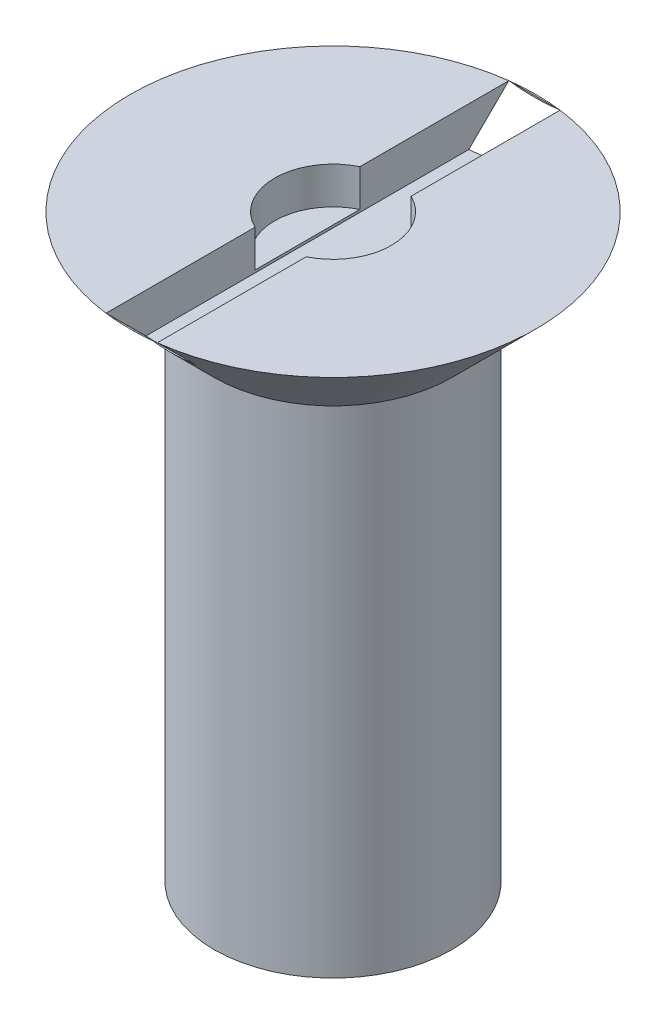
ISO-10303-21;
HEADER;
FILE_DESCRIPTION(('STEP AP214'),'2;1');
FILE_NAME('part.step','',(''),(''),'','','');
FILE_SCHEMA(('AUTOMOTIVE_DESIGN { 1 0 10303 214 1 1 1 1 }'));
ENDSEC;
DATA;
#1=APPLICATION_CONTEXT('core data for automotive mechanical design processes');
#2=APPLICATION_PROTOCOL_DEFINITION('international standard','automotive_design',2000,#1);
#3=PRODUCT_CONTEXT('',#1,'mechanical');
#4=PRODUCT('Part','Part','',(#3));
#5=PRODUCT_RELATED_PRODUCT_CATEGORY('part','',(#4));
#6=PRODUCT_DEFINITION_FORMATION('','',#4);
#7=PRODUCT_DEFINITION_CONTEXT('part definition',#1,'design');
#8=PRODUCT_DEFINITION('design','',#6,#7);
#9=PRODUCT_DEFINITION_SHAPE('','',#8);
#10=(LENGTH_UNIT() NAMED_UNIT(*) SI_UNIT(.MILLI.,.METRE.));
#11=(NAMED_UNIT(*) PLANE_ANGLE_UNIT() SI_UNIT($,.RADIAN.));
#12=(NAMED_UNIT(*) SI_UNIT($,.STERADIAN.) SOLID_ANGLE_UNIT());
#13=UNCERTAINTY_MEASURE_WITH_UNIT(LENGTH_MEASURE(1.E-05),#10,'distance_accuracy_value','');
#14=(GEOMETRIC_REPRESENTATION_CONTEXT(3) GLOBAL_UNCERTAINTY_ASSIGNED_CONTEXT((#13)) GLOBAL_UNIT_ASSIGNED_CONTEXT((#10,
#11,#12)) REPRESENTATION_CONTEXT('',''));
#15=CARTESIAN_POINT('',(0.,0.,0.));
#16=DIRECTION('',(0.,0.,1.));
#17=DIRECTION('',(1.,0.,0.));
#18=AXIS2_PLACEMENT_3D('',#15,#16,#17);
#19=CARTESIAN_POINT('',(2.94385562515375,-1.86886334227875,0.));
#20=DIRECTION('',(0.,-1.,0.));
#21=DIRECTION('',(1.,0.,0.));
#22=AXIS2_PLACEMENT_3D('',#19,#20,#21);
#23=PLANE('',#22);
#24=CARTESIAN_POINT('',(0.,-1.86886334227875,0.));
#25=DIRECTION('',(0.,1.,0.));
#26=DIRECTION('',(-1.,0.,0.));
#27=AXIS2_PLACEMENT_3D('',#24,#25,#26);
#28=CIRCLE('',#27,2.94385562515375);
#29=CARTESIAN_POINT('',(-1.29163654320021,-1.86886334227875,-2.64536594482109));
#30=VERTEX_POINT('',#29);
#31=CARTESIAN_POINT('',(-1.29163654320021,-1.86886334227875,2.64536594482109));
#32=VERTEX_POINT('',#31);
#33=EDGE_CURVE('E197',#30,#32,#28,.T.);
#34=ORIENTED_EDGE('',*,*,#33,.T.);
#35=DIRECTION('',(0.,0.,-1.));
#36=VECTOR('',#35,1.);
#37=CARTESIAN_POINT('',(-1.29163654320021,-1.86886334227875,0.));
#38=LINE('',#37,#36);
#39=EDGE_CURVE('E156',#32,#30,#38,.T.);
#40=ORIENTED_EDGE('',*,*,#39,.T.);
#41=EDGE_LOOP('',(#34,#40));
#42=FACE_BOUND('',#41,.T.);
#43=ADVANCED_FACE('F49',(#42),#23,.F.);
#44=CARTESIAN_POINT('',(0.,11.6854615251355,0.));
#45=DIRECTION('',(0.,1.,0.));
#46=DIRECTION('',(-1.,0.,0.));
#47=AXIS2_PLACEMENT_3D('',#44,#45,#46);
#48=CYLINDRICAL_SURFACE('',#47,2.94385562515375);
#49=CARTESIAN_POINT('',(0.,0.,0.));
#50=DIRECTION('',(0.,1.,0.));
#51=DIRECTION('',(-1.,0.,0.));
#52=AXIS2_PLACEMENT_3D('',#49,#50,#51);
#53=CIRCLE('',#52,2.94385562515375);
#54=CARTESIAN_POINT('',(-1.29163654320021,0.,-2.64536594482109));
#55=VERTEX_POINT('',#54);
#56=CARTESIAN_POINT('',(-1.29163654320021,0.,2.64536594482109));
#57=VERTEX_POINT('',#56);
#58=EDGE_CURVE('E152',#55,#57,#53,.T.);
#59=ORIENTED_EDGE('',*,*,#58,.T.);
#60=DIRECTION('',(0.,1.,0.));
#61=VECTOR('',#60,1.);
#62=CARTESIAN_POINT('',(-1.29163654320021,11.6854615251355,2.64536594482109));
#63=LINE('',#62,#61);
#64=EDGE_CURVE('E69',#57,#32,#63,.F.);
#65=ORIENTED_EDGE('',*,*,#64,.T.);
#66=ORIENTED_EDGE('',*,*,#33,.F.);
#67=DIRECTION('',(0.,1.,0.));
#68=VECTOR('',#67,1.);
#69=CARTESIAN_POINT('',(-1.29163654320021,11.6854615251355,-2.64536594482109));
#70=LINE('',#69,#68);
#71=EDGE_CURVE('E141',#30,#55,#70,.T.);
#72=ORIENTED_EDGE('',*,*,#71,.T.);
#73=EDGE_LOOP('',(#59,#65,#66,#72));
#74=FACE_BOUND('',#73,.T.);
#75=ADVANCED_FACE('F233',(#74),#48,.F.);
#76=CARTESIAN_POINT('',(10.2426406871193,0.,0.));
#77=DIRECTION('',(0.,-1.,0.));
#78=DIRECTION('',(1.,0.,0.));
#79=AXIS2_PLACEMENT_3D('',#76,#77,#78);
#80=PLANE('',#79);
#81=ORIENTED_EDGE('',*,*,#58,.F.);
#82=DIRECTION('',(0.,0.,1.));
#83=VECTOR('',#82,1.);
#84=CARTESIAN_POINT('',(-1.29163654320021,0.,-10.1608741398415));
#85=LINE('',#84,#83);
#86=CARTESIAN_POINT('',(-1.29163654320021,0.,-10.1608741398415));
#87=VERTEX_POINT('',#86);
#88=EDGE_CURVE('E12',#87,#55,#85,.T.);
#89=ORIENTED_EDGE('',*,*,#88,.F.);
#90=CARTESIAN_POINT('',(0.,0.,0.));
#91=DIRECTION('',(0.,1.,0.));
#92=DIRECTION('',(-1.,0.,0.));
#93=AXIS2_PLACEMENT_3D('',#90,#91,#92);
#94=CIRCLE('',#93,10.2426406871193);
#95=CARTESIAN_POINT('',(-1.29163654320021,0.,10.1608741398415));
#96=VERTEX_POINT('',#95);
#97=EDGE_CURVE('E133',#87,#96,#94,.T.);
#98=ORIENTED_EDGE('',*,*,#97,.T.);
#99=EDGE_CURVE('E60',#57,#96,#85,.T.);
#100=ORIENTED_EDGE('',*,*,#99,.F.);
#101=EDGE_LOOP('',(#81,#89,#98,#100));
#102=FACE_BOUND('',#101,.T.);
#103=ADVANCED_FACE('F139',(#102),#80,.F.);
#104=CARTESIAN_POINT('',(1.29163654320021,0.,10.1608741398415));
#105=VERTEX_POINT('',#104);
#106=CARTESIAN_POINT('',(1.29163654320021,0.,-10.1608741398415));
#107=VERTEX_POINT('',#106);
#108=EDGE_CURVE('E53',#105,#107,#94,.T.);
#109=ORIENTED_EDGE('',*,*,#108,.T.);
#110=DIRECTION('',(0.,0.,-1.));
#111=VECTOR('',#110,1.);
#112=CARTESIAN_POINT('',(1.29163654320021,0.,-10.1608741398415));
#113=LINE('',#112,#111);
#114=CARTESIAN_POINT('',(1.29163654320021,0.,-2.64536594482109));
#115=VERTEX_POINT('',#114);
#116=EDGE_CURVE('E168',#115,#107,#113,.T.);
#117=ORIENTED_EDGE('',*,*,#116,.F.);
#118=CARTESIAN_POINT('',(1.29163654320021,0.,2.64536594482109));
#119=VERTEX_POINT('',#118);
#120=EDGE_CURVE('E159',#119,#115,#53,.T.);
#121=ORIENTED_EDGE('',*,*,#120,.F.);
#122=EDGE_CURVE('E96',#105,#119,#113,.T.);
#123=ORIENTED_EDGE('',*,*,#122,.F.);
#124=EDGE_LOOP('',(#109,#117,#121,#123));
#125=FACE_BOUND('',#124,.T.);
#126=ADVANCED_FACE('F51',(#125),#80,.F.);
#127=CARTESIAN_POINT('',(0.,-4.24264068711932,0.));
#128=DIRECTION('',(0.,1.,0.));
#129=DIRECTION('',(-1.,0.,0.));
#130=AXIS2_PLACEMENT_3D('',#127,#128,#129);
#131=CONICAL_SURFACE('',#130,6.,0.78539816339744);
#132=CARTESIAN_POINT('',(0.,-4.24264068711932,0.));
#133=DIRECTION('',(0.,1.,0.));
#134=DIRECTION('',(-1.,0.,0.));
#135=AXIS2_PLACEMENT_3D('',#132,#133,#134);
#136=CIRCLE('',#135,6.);
#137=CARTESIAN_POINT('',(-6.,-4.24264068711932,0.));
#138=VERTEX_POINT('',#137);
#139=EDGE_CURVE('E145',#138,#138,#136,.T.);
#140=ORIENTED_EDGE('',*,*,#139,.T.);
#141=EDGE_LOOP('',(#140));
#142=FACE_BOUND('',#141,.T.);
#143=CARTESIAN_POINT('',(0.,-2.,0.));
#144=DIRECTION('',(0.,-1.,0.));
#145=DIRECTION('',(1.,0.,0.));
#146=AXIS2_PLACEMENT_3D('',#143,#144,#145);
#147=CIRCLE('',#146,8.24264068711929);
#148=CARTESIAN_POINT('',(1.29163654320021,-2.,8.14081080342887));
#149=VERTEX_POINT('',#148);
#150=CARTESIAN_POINT('',(-1.29163654320021,-2.,8.14081080342887));
#151=VERTEX_POINT('',#150);
#152=EDGE_CURVE('E134',#149,#151,#147,.T.);
#153=ORIENTED_EDGE('',*,*,#152,.T.);
#154=CARTESIAN_POINT('',(-1.29163654320021,0.000699999999996963,-10.1615797724892));
#155=CARTESIAN_POINT('',(-1.29163654320021,-0.302996500093124,-9.85542742451144));
#156=CARTESIAN_POINT('',(-1.29163654320021,-0.606594687373574,-9.54917735401048));
#157=CARTESIAN_POINT('',(-1.29163654320021,-1.2135834222899,-8.93629748722877));
#158=CARTESIAN_POINT('',(-1.29163654320021,-1.51697388537386,-8.62966760721775));
#159=CARTESIAN_POINT('',(-1.29163654320021,-2.12507956080093,-8.01428105674515));
#160=CARTESIAN_POINT('',(-1.29163654320021,-2.42979254020583,-7.70552217919553));
#161=CARTESIAN_POINT('',(-1.29163654320021,-3.03856888038036,-7.08753649987356));
#162=CARTESIAN_POINT('',(-1.29163654320021,-3.34263240061369,-6.77830985528668));
#163=CARTESIAN_POINT('',(-1.29163654320021,-3.84554513405426,-6.26546711483744));
#164=CARTESIAN_POINT('',(-1.29163654320021,-4.04463355728304,-6.06208566099914));
#165=CARTESIAN_POINT('',(-1.29163654320021,-4.4423286235056,-5.65484071196279));
#166=CARTESIAN_POINT('',(-1.29163654320021,-4.64093525257761,-5.45097720316378));
#167=CARTESIAN_POINT('',(-1.29163654320021,-5.03766790918317,-5.04240138371146));
#168=CARTESIAN_POINT('',(-1.29163654320021,-5.23579329084886,-4.83768844531802));
#169=CARTESIAN_POINT('',(-1.29163654320021,-5.63105494510569,-4.42735101487071));
#170=CARTESIAN_POINT('',(-1.29163654320021,-5.82819131997444,-4.22172662139709));
#171=CARTESIAN_POINT('',(-1.29163654320021,-6.22015759041879,-3.80999356709074));
#172=CARTESIAN_POINT('',(-1.29163654320021,-6.4149937967179,-3.60389093410016));
#173=CARTESIAN_POINT('',(-1.29163654320021,-6.70552876987358,-3.29304866159038));
#174=CARTESIAN_POINT('',(-1.29163654320021,-6.80210697353448,-3.18913154703183));
#175=CARTESIAN_POINT('',(-1.29163654320021,-6.99448202695853,-2.98057718447743));
#176=CARTESIAN_POINT('',(-1.29163654320021,-7.0902788838328,-2.87593994305155));
#177=CARTESIAN_POINT('',(-1.29163654320021,-7.28065371309235,-2.66589739954175));
#178=CARTESIAN_POINT('',(-1.29163654320021,-7.37523353965416,-2.56049378069947));
#179=CARTESIAN_POINT('',(-1.29163654320021,-7.56293183260334,-2.3483957170731));
#180=CARTESIAN_POINT('',(-1.29163654320021,-7.65605035907015,-2.24170132567851));
#181=CARTESIAN_POINT('',(-1.29163654320021,-7.8401054757069,-2.02656223294574));
#182=CARTESIAN_POINT('',(-1.29163654320021,-7.93104343671248,-1.91811870698384));
#183=CARTESIAN_POINT('',(-1.29163654320021,-8.10968769655575,-1.69861006419586));
#184=CARTESIAN_POINT('',(-1.29163654320021,-8.19739484302297,-1.58754564770835));
#185=CARTESIAN_POINT('',(-1.29163654320021,-8.30893719057413,-1.43923945389587));
#186=CARTESIAN_POINT('',(-1.29163654320021,-8.3351796086986,-1.40380861775216));
#187=CARTESIAN_POINT('',(-1.29163654320021,-8.38704116630148,-1.33248910798558));
#188=CARTESIAN_POINT('',(-1.29163654320021,-8.41266026354132,-1.29660040358564));
#189=CARTESIAN_POINT('',(-1.29163654320021,-8.4631698532084,-1.22428010561553));
#190=CARTESIAN_POINT('',(-1.29163654320021,-8.48805990073884,-1.18784820021207));
#191=CARTESIAN_POINT('',(-1.29163654320021,-8.53693626601401,-1.11438416842821));
#192=CARTESIAN_POINT('',(-1.29163654320021,-8.56092259492751,-1.07735204947378));
#193=CARTESIAN_POINT('',(-1.29163654320021,-8.63078462579718,-0.965970184704957));
#194=CARTESIAN_POINT('',(-1.29163654320021,-8.67507747932987,-0.890611953383751));
#195=CARTESIAN_POINT('',(-1.29163654320021,-8.75722766837279,-0.73646026716072));
#196=CARTESIAN_POINT('',(-1.29163654320021,-8.79509285959847,-0.657671155621784));
#197=CARTESIAN_POINT('',(-1.29163654320021,-8.84413776591269,-0.537379638672582));
#198=CARTESIAN_POINT('',(-1.29163654320021,-8.85906308872809,-0.497408997332436));
#199=CARTESIAN_POINT('',(-1.29163654320021,-8.88604763387855,-0.416503121747637));
#200=CARTESIAN_POINT('',(-1.29163654320021,-8.89810720382036,-0.375568005153518));
#201=CARTESIAN_POINT('',(-1.29163654320021,-8.91878176142513,-0.293026239366507));
#202=CARTESIAN_POINT('',(-1.29163654320021,-8.92741245247006,-0.251423581143238));
#203=CARTESIAN_POINT('',(-1.29163654320021,-8.94083146043682,-0.167605339619782));
#204=CARTESIAN_POINT('',(-1.29163654320021,-8.94562096653729,-0.125389950136628));
#205=CARTESIAN_POINT('',(-1.29163654320021,-8.95108066241319,-0.0402765935832646));
#206=CARTESIAN_POINT('',(-1.29163654320021,-8.95171044303661,0.00262402240665479));
#207=CARTESIAN_POINT('',(-1.29163654320021,-8.94869918622454,0.0882720670962686));
#208=CARTESIAN_POINT('',(-1.29163654320021,-8.94505811575285,0.131019494608443));
#209=CARTESIAN_POINT('',(-1.29163654320021,-8.93373209445695,0.216106387638561));
#210=CARTESIAN_POINT('',(-1.29163654320021,-8.92603411122369,0.258444087985413));
#211=CARTESIAN_POINT('',(-1.29163654320021,-8.90703939335149,0.342311059787869));
#212=CARTESIAN_POINT('',(-1.29163654320021,-8.89574081787769,0.383839906160012));
#213=CARTESIAN_POINT('',(-1.29163654320021,-8.86348835450478,0.487059110100052));
#214=CARTESIAN_POINT('',(-1.29163654320021,-8.84055768058911,0.548129184893209));
#215=CARTESIAN_POINT('',(-1.29163654320021,-8.78948847433865,0.668040349429958));
#216=CARTESIAN_POINT('',(-1.29163654320021,-8.76134588652136,0.726879660127751));
#217=CARTESIAN_POINT('',(-1.29163654320021,-8.70113535592895,0.842840331196569));
#218=CARTESIAN_POINT('',(-1.29163654320021,-8.66904971835273,0.899952399661288));
#219=CARTESIAN_POINT('',(-1.29163654320021,-8.61883389191487,0.984343218052824));
#220=CARTESIAN_POINT('',(-1.29163654320021,-8.60175053303652,1.01225587796841));
#221=CARTESIAN_POINT('',(-1.29163654320021,-8.56697842742954,1.06770087033013));
#222=CARTESIAN_POINT('',(-1.29163654320021,-8.54928969969328,1.09523321467001));
#223=CARTESIAN_POINT('',(-1.29163654320021,-8.48854016382386,1.18784567670793));
#224=CARTESIAN_POINT('',(-1.29163654320021,-8.44426267658578,1.25212820468414));
#225=CARTESIAN_POINT('',(-1.29163654320021,-8.35359068875316,1.37918809727196));
#226=CARTESIAN_POINT('',(-1.29163654320021,-8.30719571042385,1.44196511729835));
#227=CARTESIAN_POINT('',(-1.29163654320021,-8.21281124446925,1.5663735243124));
#228=CARTESIAN_POINT('',(-1.29163654320021,-8.16482067418699,1.62800408727356));
#229=CARTESIAN_POINT('',(-1.29163654320021,-8.06765076704714,1.75032278959502));
#230=CARTESIAN_POINT('',(-1.29163654320021,-8.01847136192546,1.81101087450709));
#231=CARTESIAN_POINT('',(-1.29163654320021,-7.86933471306289,1.9922378662906));
#232=CARTESIAN_POINT('',(-1.29163654320021,-7.76800574745381,2.11164642234709));
#233=CARTESIAN_POINT('',(-1.29163654320021,-7.56310368837351,2.3484195597235));
#234=CARTESIAN_POINT('',(-1.29163654320021,-7.45953153121894,2.46578495832382));
#235=CARTESIAN_POINT('',(-1.29163654320021,-7.25049162721505,2.69951345030942));
#236=CARTESIAN_POINT('',(-1.29163654320021,-7.14501873851182,2.81587193696291));
#237=CARTESIAN_POINT('',(-1.29163654320021,-6.9329621026066,3.04759122743906));
#238=CARTESIAN_POINT('',(-1.29163654320021,-6.82637824409972,3.16295192913623));
#239=CARTESIAN_POINT('',(-1.29163654320021,-6.5057633017913,3.50757667561281));
#240=CARTESIAN_POINT('',(-1.29163654320021,-6.29054804726593,3.73573786311173));
#241=CARTESIAN_POINT('',(-1.29163654320021,-5.8230931236419,4.22737516792702));
#242=CARTESIAN_POINT('',(-1.29163654320021,-5.57053508871108,4.49054730237622));
#243=CARTESIAN_POINT('',(-1.29163654320021,-5.06395770672692,5.01548950519538));
#244=CARTESIAN_POINT('',(-1.29163654320021,-4.8099383311756,5.27725954602921));
#245=CARTESIAN_POINT('',(-1.29163654320021,-4.30080111574724,5.80005529995346));
#246=CARTESIAN_POINT('',(-1.29163654320021,-4.04568267597979,6.06108042816869));
#247=CARTESIAN_POINT('',(-1.29163654320021,-3.53480894316066,6.58250683116708));
#248=CARTESIAN_POINT('',(-1.29163654320021,-3.27905364957547,6.84290810542725));
#249=CARTESIAN_POINT('',(-1.29163654320021,-2.77162162545359,7.35866062020349));
#250=CARTESIAN_POINT('',(-1.29163654320021,-2.51995282683867,7.61401966778888));
#251=CARTESIAN_POINT('',(-1.29163654320021,-2.0162917827461,8.12441970469568));
#252=CARTESIAN_POINT('',(-1.29163654320021,-1.76429953650749,8.379460693266));
#253=CARTESIAN_POINT('',(-1.29163654320021,-1.26024715174644,8.88912222281385));
#254=CARTESIAN_POINT('',(-1.29163654320021,-1.00818718445065,9.14374293316854));
#255=CARTESIAN_POINT('',(-1.29163654320021,-0.503875090814231,9.65279246937312));
#256=CARTESIAN_POINT('',(-1.29163654320021,-0.251622965057562,9.90722129580148));
#257=CARTESIAN_POINT('',(-1.29163654320021,0.000699999999992939,10.1615797724892));
#258=B_SPLINE_CURVE_WITH_KNOTS('',3,(#154,#155,#156,#157,#158,#159,#160,#161,#162,#163,#164,
#165,#166,#167,#168,#169,#170,#171,#172,#173,#174,#175,#176,#177,#178,#179,#180,#181,#182,#183,
#184,#185,#186,#187,#188,#189,#190,#191,#192,#193,#194,#195,#196,#197,#198,#199,#200,#201,#202,
#203,#204,#205,#206,#207,#208,#209,#210,#211,#212,#213,#214,#215,#216,#217,#218,#219,#220,#221,
#222,#223,#224,#225,#226,#227,#228,#229,#230,#231,#232,#233,#234,#235,#236,#237,#238,#239,#240,
#241,#242,#243,#244,#245,#246,#247,#248,#249,#250,#251,#252,#253,#254,#255,#256,#257),
.UNSPECIFIED.,.F.,.F.,(4,2,2,2,2,2,2,2,2,2,2,2,2,2,2,2,2,2,2,2,2,2,2,2,2,2,2,2,2,2,2,2,2,2,2,2,
2,2,2,2,2,2,2,2,2,2,2,2,2,2,2,4),(0.,1.2936954524193,2.58776203365729,3.88916021729786,
5.19019003495619,6.04400554888199,6.89784544732693,7.75250647238086,8.60707721179889,
9.45791917210119,9.88351598611126,10.3091089223858,10.7339500713138,11.1587737074501,
11.583322873591,12.0077598509054,12.140027168562,12.2723034243261,12.4046587864535,
12.5370125123056,12.7990621614107,13.0607891978882,13.1887024482362,13.3166001751842,
13.4439052181426,13.5711708339606,13.6996709606665,13.8281720813626,13.9570885375528,
14.0860710094561,14.2814165001638,14.4769146362205,14.6733245290615,14.7714954157651,
14.8696632253509,15.1037630805029,15.337916015402,15.5722312095875,15.8065598904954,
16.276328325701,16.745904319188,17.2170354627427,17.688214270154,18.629137713735,
19.7233907667489,20.8176652319014,21.9126413344647,23.0076183546202,24.0832149612165,
25.1588141030105,26.233659748181,27.3085021399249),.UNSPECIFIED.);
#259=EDGE_CURVE('E121',#151,#96,#258,.T.);
#260=ORIENTED_EDGE('',*,*,#259,.T.);
#261=ORIENTED_EDGE('',*,*,#97,.F.);
#262=CARTESIAN_POINT('',(-1.29163654320021,-2.,-8.14081080342887));
#263=VERTEX_POINT('',#262);
#264=EDGE_CURVE('E136',#87,#263,#258,.T.);
#265=ORIENTED_EDGE('',*,*,#264,.T.);
#266=CARTESIAN_POINT('',(1.29163654320021,-2.,-8.14081080342887));
#267=VERTEX_POINT('',#266);
#268=EDGE_CURVE('E186',#263,#267,#147,.T.);
#269=ORIENTED_EDGE('',*,*,#268,.T.);
#270=CARTESIAN_POINT('',(1.29163654320021,0.000699999999996963,10.1615797724892));
#271=CARTESIAN_POINT('',(1.29163654320021,-0.302996500093124,9.85542742451143));
#272=CARTESIAN_POINT('',(1.29163654320021,-0.606594687373576,9.54917735401047));
#273=CARTESIAN_POINT('',(1.29163654320021,-1.2135834222899,8.93629748722877));
#274=CARTESIAN_POINT('',(1.29163654320021,-1.51697388537387,8.62966760721775));
#275=CARTESIAN_POINT('',(1.29163654320021,-2.12507956080093,8.01428105674515));
#276=CARTESIAN_POINT('',(1.29163654320021,-2.42979254020583,7.70552217919552));
#277=CARTESIAN_POINT('',(1.29163654320021,-3.03856888038037,7.08753649987355));
#278=CARTESIAN_POINT('',(1.29163654320022,-3.3426324006137,6.77830985528667));
#279=CARTESIAN_POINT('',(1.29163654320022,-3.84554513405427,6.26546711483743));
#280=CARTESIAN_POINT('',(1.29163654320022,-4.04463355728305,6.06208566099913));
#281=CARTESIAN_POINT('',(1.29163654320022,-4.44232862350561,5.65484071196278));
#282=CARTESIAN_POINT('',(1.29163654320022,-4.64093525257762,5.45097720316377));
#283=CARTESIAN_POINT('',(1.29163654320022,-5.03766790918318,5.04240138371145));
#284=CARTESIAN_POINT('',(1.29163654320022,-5.23579329084887,4.83768844531801));
#285=CARTESIAN_POINT('',(1.29163654320022,-5.6310549451057,4.42735101487071));
#286=CARTESIAN_POINT('',(1.29163654320022,-5.82819131997445,4.22172662139708));
#287=CARTESIAN_POINT('',(1.29163654320022,-6.22015759041879,3.80999356709073));
#288=CARTESIAN_POINT('',(1.29163654320022,-6.41499379671791,3.60389093410016));
#289=CARTESIAN_POINT('',(1.29163654320022,-6.70552876987358,3.29304866159037));
#290=CARTESIAN_POINT('',(1.29163654320022,-6.80210697353448,3.18913154703182));
#291=CARTESIAN_POINT('',(1.29163654320022,-6.99448202695853,2.98057718447743));
#292=CARTESIAN_POINT('',(1.29163654320022,-7.0902788838328,2.87593994305155));
#293=CARTESIAN_POINT('',(1.29163654320022,-7.28065371309236,2.66589739954175));
#294=CARTESIAN_POINT('',(1.29163654320022,-7.37523353965416,2.56049378069947));
#295=CARTESIAN_POINT('',(1.29163654320022,-7.56293183260334,2.34839571707309));
#296=CARTESIAN_POINT('',(1.29163654320022,-7.65605035907015,2.24170132567851));
#297=CARTESIAN_POINT('',(1.29163654320022,-7.8401054757069,2.02656223294573));
#298=CARTESIAN_POINT('',(1.29163654320022,-7.93104343671249,1.91811870698384));
#299=CARTESIAN_POINT('',(1.29163654320022,-8.10968769655576,1.69861006419586));
#300=CARTESIAN_POINT('',(1.29163654320022,-8.19739484302297,1.58754564770835));
#301=CARTESIAN_POINT('',(1.29163654320022,-8.30893719057413,1.43923945389587));
#302=CARTESIAN_POINT('',(1.29163654320022,-8.3351796086986,1.40380861775216));
#303=CARTESIAN_POINT('',(1.29163654320022,-8.38704116630148,1.33248910798558));
#304=CARTESIAN_POINT('',(1.29163654320022,-8.41266026354131,1.29660040358564));
#305=CARTESIAN_POINT('',(1.29163654320022,-8.4631698532084,1.22428010561553));
#306=CARTESIAN_POINT('',(1.29163654320022,-8.48805990073884,1.18784820021207));
#307=CARTESIAN_POINT('',(1.29163654320022,-8.53693626601402,1.11438416842822));
#308=CARTESIAN_POINT('',(1.29163654320022,-8.56092259492751,1.07735204947378));
#309=CARTESIAN_POINT('',(1.29163654320022,-8.63078462579718,0.965970184704957));
#310=CARTESIAN_POINT('',(1.29163654320022,-8.67507747932987,0.89061195338375));
#311=CARTESIAN_POINT('',(1.29163654320022,-8.75722766837279,0.736460267160719));
#312=CARTESIAN_POINT('',(1.29163654320022,-8.79509285959847,0.657671155621783));
#313=CARTESIAN_POINT('',(1.29163654320022,-8.84413776591269,0.537379638672581));
#314=CARTESIAN_POINT('',(1.29163654320022,-8.85906308872809,0.497408997332435));
#315=CARTESIAN_POINT('',(1.29163654320022,-8.88604763387855,0.416503121747636));
#316=CARTESIAN_POINT('',(1.29163654320022,-8.89810720382036,0.375568005153517));
#317=CARTESIAN_POINT('',(1.29163654320022,-8.91878176142513,0.293026239366506));
#318=CARTESIAN_POINT('',(1.29163654320022,-8.92741245247006,0.251423581143237));
#319=CARTESIAN_POINT('',(1.29163654320022,-8.94083146043682,0.167605339619781));
#320=CARTESIAN_POINT('',(1.29163654320022,-8.94562096653729,0.125389950136627));
#321=CARTESIAN_POINT('',(1.29163654320022,-8.95108066241319,0.0402765935832633));
#322=CARTESIAN_POINT('',(1.29163654320022,-8.95171044303661,-0.00262402240665614));
#323=CARTESIAN_POINT('',(1.29163654320022,-8.94869918622454,-0.0882720670962699));
#324=CARTESIAN_POINT('',(1.29163654320022,-8.94505811575285,-0.131019494608444));
#325=CARTESIAN_POINT('',(1.29163654320022,-8.93373209445695,-0.216106387638562));
#326=CARTESIAN_POINT('',(1.29163654320022,-8.92603411122369,-0.258444087985416));
#327=CARTESIAN_POINT('',(1.29163654320022,-8.90703939335149,-0.342311059787871));
#328=CARTESIAN_POINT('',(1.29163654320022,-8.89574081787769,-0.383839906160014));
#329=CARTESIAN_POINT('',(1.29163654320022,-8.86348835450477,-0.487059110100053));
#330=CARTESIAN_POINT('',(1.29163654320022,-8.84055768058911,-0.548129184893211));
#331=CARTESIAN_POINT('',(1.29163654320022,-8.78948847433865,-0.66804034942996));
#332=CARTESIAN_POINT('',(1.29163654320022,-8.76134588652136,-0.726879660127753));
#333=CARTESIAN_POINT('',(1.29163654320022,-8.70113535592895,-0.842840331196571));
#334=CARTESIAN_POINT('',(1.29163654320022,-8.66904971835273,-0.89995239966129));
#335=CARTESIAN_POINT('',(1.29163654320022,-8.61883389191487,-0.984343218052826));
#336=CARTESIAN_POINT('',(1.29163654320022,-8.60175053303651,-1.01225587796841));
#337=CARTESIAN_POINT('',(1.29163654320022,-8.56697842742954,-1.06770087033013));
#338=CARTESIAN_POINT('',(1.29163654320022,-8.54928969969328,-1.09523321467001));
#339=CARTESIAN_POINT('',(1.29163654320022,-8.48854016382386,-1.18784567670793));
#340=CARTESIAN_POINT('',(1.29163654320022,-8.44426267658578,-1.25212820468414));
#341=CARTESIAN_POINT('',(1.29163654320022,-8.35359068875316,-1.37918809727196));
#342=CARTESIAN_POINT('',(1.29163654320022,-8.30719571042385,-1.44196511729835));
#343=CARTESIAN_POINT('',(1.29163654320022,-8.21281124446924,-1.56637352431241));
#344=CARTESIAN_POINT('',(1.29163654320022,-8.16482067418698,-1.62800408727357));
#345=CARTESIAN_POINT('',(1.29163654320022,-8.06765076704713,-1.75032278959502));
#346=CARTESIAN_POINT('',(1.29163654320022,-8.01847136192546,-1.81101087450709));
#347=CARTESIAN_POINT('',(1.29163654320022,-7.86933471306289,-1.9922378662906));
#348=CARTESIAN_POINT('',(1.29163654320022,-7.76800574745381,-2.11164642234709));
#349=CARTESIAN_POINT('',(1.29163654320022,-7.5631036883735,-2.34841955972351));
#350=CARTESIAN_POINT('',(1.29163654320022,-7.45953153121894,-2.46578495832383));
#351=CARTESIAN_POINT('',(1.29163654320022,-7.25049162721504,-2.69951345030943));
#352=CARTESIAN_POINT('',(1.29163654320022,-7.14501873851182,-2.81587193696291));
#353=CARTESIAN_POINT('',(1.29163654320022,-6.93296210260659,-3.04759122743907));
#354=CARTESIAN_POINT('',(1.29163654320022,-6.82637824409971,-3.16295192913624));
#355=CARTESIAN_POINT('',(1.29163654320022,-6.50576330179129,-3.50757667561282));
#356=CARTESIAN_POINT('',(1.29163654320022,-6.29054804726592,-3.73573786311174));
#357=CARTESIAN_POINT('',(1.29163654320022,-5.82309312364189,-4.22737516792703));
#358=CARTESIAN_POINT('',(1.29163654320022,-5.57053508871107,-4.49054730237623));
#359=CARTESIAN_POINT('',(1.29163654320022,-5.06395770672691,-5.01548950519539));
#360=CARTESIAN_POINT('',(1.29163654320022,-4.80993833117559,-5.27725954602922));
#361=CARTESIAN_POINT('',(1.29163654320022,-4.30080111574723,-5.80005529995347));
#362=CARTESIAN_POINT('',(1.29163654320022,-4.04568267597978,-6.0610804281687));
#363=CARTESIAN_POINT('',(1.29163654320022,-3.53480894316065,-6.58250683116708));
#364=CARTESIAN_POINT('',(1.29163654320022,-3.27905364957546,-6.84290810542726));
#365=CARTESIAN_POINT('',(1.29163654320022,-2.77162162545358,-7.3586606202035));
#366=CARTESIAN_POINT('',(1.29163654320021,-2.51995282683866,-7.61401966778889));
#367=CARTESIAN_POINT('',(1.29163654320021,-2.0162917827461,-8.12441970469568));
#368=CARTESIAN_POINT('',(1.29163654320021,-1.76429953650749,-8.37946069326601));
#369=CARTESIAN_POINT('',(1.29163654320021,-1.26024715174644,-8.88912222281385));
#370=CARTESIAN_POINT('',(1.29163654320021,-1.00818718445065,-9.14374293316854));
#371=CARTESIAN_POINT('',(1.29163654320021,-0.503875090814232,-9.65279246937312));
#372=CARTESIAN_POINT('',(1.29163654320021,-0.251622965057563,-9.90722129580148));
#373=CARTESIAN_POINT('',(1.29163654320021,0.000699999999992975,-10.1615797724892));
#374=B_SPLINE_CURVE_WITH_KNOTS('',3,(#270,#271,#272,#273,#274,#275,#276,#277,#278,#279,#280,
#281,#282,#283,#284,#285,#286,#287,#288,#289,#290,#291,#292,#293,#294,#295,#296,#297,#298,#299,
#300,#301,#302,#303,#304,#305,#306,#307,#308,#309,#310,#311,#312,#313,#314,#315,#316,#317,#318,
#319,#320,#321,#322,#323,#324,#325,#326,#327,#328,#329,#330,#331,#332,#333,#334,#335,#336,#337,
#338,#339,#340,#341,#342,#343,#344,#345,#346,#347,#348,#349,#350,#351,#352,#353,#354,#355,#356,
#357,#358,#359,#360,#361,#362,#363,#364,#365,#366,#367,#368,#369,#370,#371,#372,#373),
.UNSPECIFIED.,.F.,.F.,(4,2,2,2,2,2,2,2,2,2,2,2,2,2,2,2,2,2,2,2,2,2,2,2,2,2,2,2,2,2,2,2,2,2,2,2,
2,2,2,2,2,2,2,2,2,2,2,2,2,2,2,4),(0.,1.2936954524193,2.5877620336573,3.88916021729787,
5.19019003495621,6.04400554888201,6.89784544732695,7.75250647238087,8.6070772117989,
9.45791917210119,9.88351598611127,10.3091089223858,10.7339500713138,11.1587737074501,
11.583322873591,12.0077598509054,12.140027168562,12.2723034243261,12.4046587864535,
12.5370125123056,12.7990621614107,13.0607891978882,13.1887024482362,13.3166001751842,
13.4439052181426,13.5711708339606,13.6996709606665,13.8281720813626,13.9570885375528,
14.0860710094561,14.2814165001638,14.4769146362205,14.6733245290615,14.7714954157651,
14.8696632253509,15.1037630805029,15.337916015402,15.5722312095875,15.8065598904955,
16.2763283257011,16.745904319188,17.2170354627428,17.688214270154,18.629137713735,
19.723390766749,20.8176652319014,21.9126413344647,23.0076183546202,24.0832149612165,
25.1588141030105,26.233659748181,27.3085021399249),.UNSPECIFIED.);
#375=EDGE_CURVE('E180',#267,#107,#374,.T.);
#376=ORIENTED_EDGE('',*,*,#375,.T.);
#377=ORIENTED_EDGE('',*,*,#108,.F.);
#378=EDGE_CURVE('E92',#105,#149,#374,.T.);
#379=ORIENTED_EDGE('',*,*,#378,.T.);
#380=EDGE_LOOP('',(#153,#260,#261,#265,#269,#376,#377,#379));
#381=FACE_BOUND('',#380,.T.);
#382=ADVANCED_FACE('F131',(#142,#381),#131,.T.);
#383=CARTESIAN_POINT('',(1.29163654320021,-1.86886334227875,2.64536594482109));
#384=VERTEX_POINT('',#383);
#385=CARTESIAN_POINT('',(1.29163654320021,-1.86886334227875,-2.64536594482109));
#386=VERTEX_POINT('',#385);
#387=EDGE_CURVE('E163',#384,#386,#28,.T.);
#388=ORIENTED_EDGE('',*,*,#387,.T.);
#389=DIRECTION('',(0.,0.,1.));
#390=VECTOR('',#389,1.);
#391=CARTESIAN_POINT('',(1.29163654320021,-1.86886334227875,0.));
#392=LINE('',#391,#390);
#393=EDGE_CURVE('E160',#386,#384,#392,.T.);
#394=ORIENTED_EDGE('',*,*,#393,.T.);
#395=EDGE_LOOP('',(#388,#394));
#396=FACE_BOUND('',#395,.T.);
#397=ADVANCED_FACE('F235',(#396),#23,.F.);
#398=ORIENTED_EDGE('',*,*,#120,.T.);
#399=DIRECTION('',(0.,1.,0.));
#400=VECTOR('',#399,1.);
#401=CARTESIAN_POINT('',(1.29163654320021,11.6854615251355,-2.64536594482109));
#402=LINE('',#401,#400);
#403=EDGE_CURVE('E116',#115,#386,#402,.F.);
#404=ORIENTED_EDGE('',*,*,#403,.T.);
#405=ORIENTED_EDGE('',*,*,#387,.F.);
#406=DIRECTION('',(0.,1.,0.));
#407=VECTOR('',#406,1.);
#408=CARTESIAN_POINT('',(1.29163654320021,11.6854615251355,2.64536594482109));
#409=LINE('',#408,#407);
#410=EDGE_CURVE('E101',#384,#119,#409,.T.);
#411=ORIENTED_EDGE('',*,*,#410,.T.);
#412=EDGE_LOOP('',(#398,#404,#405,#411));
#413=FACE_BOUND('',#412,.T.);
#414=ADVANCED_FACE('F240',(#413),#48,.F.);
#415=CARTESIAN_POINT('',(0.,11.6854615251355,0.));
#416=DIRECTION('',(0.,1.,0.));
#417=DIRECTION('',(-1.,0.,0.));
#418=AXIS2_PLACEMENT_3D('',#415,#416,#417);
#419=CYLINDRICAL_SURFACE('',#418,6.);
#420=ORIENTED_EDGE('',*,*,#139,.F.);
#421=EDGE_LOOP('',(#420));
#422=FACE_BOUND('',#421,.T.);
#423=CARTESIAN_POINT('',(0.,-29.2426406871193,0.));
#424=DIRECTION('',(0.,1.,0.));
#425=DIRECTION('',(-1.,0.,0.));
#426=AXIS2_PLACEMENT_3D('',#423,#424,#425);
#427=CIRCLE('',#426,6.);
#428=CARTESIAN_POINT('',(-5.99999999999999,-29.2426406871193,0.));
#429=VERTEX_POINT('',#428);
#430=EDGE_CURVE('E166',#429,#429,#427,.T.);
#431=ORIENTED_EDGE('',*,*,#430,.T.);
#432=EDGE_LOOP('',(#431));
#433=FACE_BOUND('',#432,.T.);
#434=ADVANCED_FACE('F230',(#422,#433),#419,.T.);
#435=CARTESIAN_POINT('',(6.00000000000001,-29.2426406871193,0.));
#436=DIRECTION('',(0.,1.,0.));
#437=DIRECTION('',(-1.,0.,0.));
#438=AXIS2_PLACEMENT_3D('',#435,#436,#437);
#439=PLANE('',#438);
#440=ORIENTED_EDGE('',*,*,#430,.F.);
#441=EDGE_LOOP('',(#440));
#442=FACE_BOUND('',#441,.T.);
#443=ADVANCED_FACE('F225',(#442),#439,.F.);
#444=CARTESIAN_POINT('',(0.,-2.,0.));
#445=DIRECTION('',(0.,-1.,0.));
#446=DIRECTION('',(1.,0.,0.));
#447=AXIS2_PLACEMENT_3D('',#444,#445,#446);
#448=PLANE('',#447);
#449=DIRECTION('',(0.,0.,-1.));
#450=VECTOR('',#449,1.);
#451=CARTESIAN_POINT('',(1.29163654320021,-2.,-10.1608741398415));
#452=LINE('',#451,#450);
#453=EDGE_CURVE('E170',#149,#267,#452,.T.);
#454=ORIENTED_EDGE('',*,*,#453,.T.);
#455=ORIENTED_EDGE('',*,*,#268,.F.);
#456=DIRECTION('',(0.,0.,1.));
#457=VECTOR('',#456,1.);
#458=CARTESIAN_POINT('',(-1.29163654320021,-2.,-10.1608741398415));
#459=LINE('',#458,#457);
#460=EDGE_CURVE('E173',#263,#151,#459,.T.);
#461=ORIENTED_EDGE('',*,*,#460,.T.);
#462=ORIENTED_EDGE('',*,*,#152,.F.);
#463=EDGE_LOOP('',(#454,#455,#461,#462));
#464=FACE_BOUND('',#463,.T.);
#465=ADVANCED_FACE('F221',(#464),#448,.F.);
#466=CARTESIAN_POINT('',(1.29163654320021,-2.,-10.1608741398415));
#467=DIRECTION('',(1.,0.,0.));
#468=DIRECTION('',(0.,1.,0.));
#469=AXIS2_PLACEMENT_3D('',#466,#467,#468);
#470=PLANE('',#469);
#471=ORIENTED_EDGE('',*,*,#116,.T.);
#472=ORIENTED_EDGE('',*,*,#375,.F.);
#473=ORIENTED_EDGE('',*,*,#453,.F.);
#474=ORIENTED_EDGE('',*,*,#378,.F.);
#475=ORIENTED_EDGE('',*,*,#122,.T.);
#476=ORIENTED_EDGE('',*,*,#410,.F.);
#477=ORIENTED_EDGE('',*,*,#393,.F.);
#478=ORIENTED_EDGE('',*,*,#403,.F.);
#479=EDGE_LOOP('',(#471,#472,#473,#474,#475,#476,#477,#478));
#480=FACE_BOUND('',#479,.T.);
#481=ADVANCED_FACE('F179',(#480),#470,.F.);
#482=CARTESIAN_POINT('',(-1.29163654320021,-2.,-10.1608741398415));
#483=DIRECTION('',(-1.,0.,0.));
#484=DIRECTION('',(0.,-1.,0.));
#485=AXIS2_PLACEMENT_3D('',#482,#483,#484);
#486=PLANE('',#485);
#487=ORIENTED_EDGE('',*,*,#99,.T.);
#488=ORIENTED_EDGE('',*,*,#259,.F.);
#489=ORIENTED_EDGE('',*,*,#460,.F.);
#490=ORIENTED_EDGE('',*,*,#264,.F.);
#491=ORIENTED_EDGE('',*,*,#88,.T.);
#492=ORIENTED_EDGE('',*,*,#71,.F.);
#493=ORIENTED_EDGE('',*,*,#39,.F.);
#494=ORIENTED_EDGE('',*,*,#64,.F.);
#495=EDGE_LOOP('',(#487,#488,#489,#490,#491,#492,#493,#494));
#496=FACE_BOUND('',#495,.T.);
#497=ADVANCED_FACE('F119',(#496),#486,.F.);
#498=CLOSED_SHELL('',(#43,#75,#103,#126,#382,#397,#414,#434,#443,#465,#481,#497));
#499=MANIFOLD_SOLID_BREP('B2',#498);
#500=CARTESIAN_POINT('',(0.,-4.24264068711932,0.));
#501=DIRECTION('',(0.,1.,0.));
#502=DIRECTION('',(-1.,0.,0.));
#503=AXIS2_PLACEMENT_3D('',#500,#501,#502);
#504=CONICAL_SURFACE('',#503,6.,0.78539816339744);
#505=CARTESIAN_POINT('',(0.,0.,0.));
#506=DIRECTION('',(0.,1.,0.));
#507=DIRECTION('',(-1.,0.,0.));
#508=AXIS2_PLACEMENT_3D('',#505,#506,#507);
#509=CIRCLE('',#508,10.2426406871193);
#510=CARTESIAN_POINT('',(-1.29163654320021,0.,10.1608741398415));
#511=VERTEX_POINT('',#510);
#512=CARTESIAN_POINT('',(1.29163654320022,0.,10.1608741398415));
#513=VERTEX_POINT('',#512);
#514=EDGE_CURVE('E346',#511,#513,#509,.T.);
#515=ORIENTED_EDGE('',*,*,#514,.F.);
#516=CARTESIAN_POINT('',(-4.558838202049,0.894071980367604,10.1608741398415));
#517=CARTESIAN_POINT('',(-4.219567525036,0.755171784731834,10.1608741398415));
#518=CARTESIAN_POINT('',(-3.8754074776991,0.627206994175377,10.1608741398415));
#519=CARTESIAN_POINT('',(-3.17717443387673,0.398261604624434,10.1608741398415));
#520=CARTESIAN_POINT('',(-2.82307533620971,0.297361205882699,10.1608741398415));
#521=CARTESIAN_POINT('',(-2.11020636390404,0.12933255575306,10.1608741398415));
#522=CARTESIAN_POINT('',(-1.75151201879968,0.0618948171412621,10.1608741398415));
#523=CARTESIAN_POINT('',(-1.21001158374448,-0.0115409933862248,10.1608741398415));
#524=CARTESIAN_POINT('',(-1.02900951980854,-0.0313970081124885,10.1608741398415));
#525=CARTESIAN_POINT('',(-0.666220622350781,-0.0615510429693485,10.1608741398415));
#526=CARTESIAN_POINT('',(-0.484433917455901,-0.0718505740698269,10.1608741398415));
#527=CARTESIAN_POINT('',(-0.129177381328481,-0.0824225091061394,10.1608741398415));
#528=CARTESIAN_POINT('',(0.0442791024997399,-0.0831461795733427,10.1608741398415));
#529=CARTESIAN_POINT('',(0.390979073600575,-0.0757261948630692,10.1608741398415));
#530=CARTESIAN_POINT('',(0.564222571955882,-0.0675830224771143,10.1608741398415));
#531=CARTESIAN_POINT('',(1.08314488012124,-0.0300107180484036,10.1608741398415));
#532=CARTESIAN_POINT('',(1.42795013468256,0.0125630771144163,10.1608741398415));
#533=CARTESIAN_POINT('',(2.11157042274699,0.129847114156141,10.1608741398415));
#534=CARTESIAN_POINT('',(2.450390202005,0.204530585630894,10.1608741398415));
#535=CARTESIAN_POINT('',(3.1206729517589,0.381737526876228,10.1608741398415));
#536=CARTESIAN_POINT('',(3.45213449180103,0.484266359440671,10.1608741398415));
#537=CARTESIAN_POINT('',(3.91079819301816,0.644164565714024,10.1608741398415));
#538=CARTESIAN_POINT('',(4.04148760740306,0.691823038128701,10.1608741398415));
#539=CARTESIAN_POINT('',(4.3012750984735,0.790488595562608,10.1608741398415));
#540=CARTESIAN_POINT('',(4.43037599876004,0.841488238869122,10.1608741398415));
#541=CARTESIAN_POINT('',(4.55883820204901,0.894071980367593,10.1608741398415));
#542=B_SPLINE_CURVE_WITH_KNOTS('',3,(#516,#517,#518,#519,#520,#521,#522,#523,#524,#525,#526,
#527,#528,#529,#530,#531,#532,#533,#534,#535,#536,#537,#538,#539,#540,#541),.UNSPECIFIED.,.F.,
.F.,(4,2,2,2,2,2,2,2,2,2,2,2,4),(0.,1.10017707887492,2.20357918425543,3.29657660829168,
3.8426298386726,4.38859671818619,4.90873776884797,5.42885049971914,6.46927122650527,
7.50882621309432,8.54858155181132,8.96587206258628,9.38226282793786),.UNSPECIFIED.);
#543=EDGE_CURVE('E355',#511,#513,#542,.T.);
#544=ORIENTED_EDGE('',*,*,#543,.T.);
#545=EDGE_LOOP('',(#515,#544));
#546=FACE_BOUND('',#545,.T.);
#547=ADVANCED_FACE('F342',(#546),#504,.T.);
#548=CARTESIAN_POINT('',(10.2426406871193,0.,0.));
#549=DIRECTION('',(0.,-1.,0.));
#550=DIRECTION('',(1.,0.,0.));
#551=AXIS2_PLACEMENT_3D('',#548,#549,#550);
#552=PLANE('',#551);
#553=ORIENTED_EDGE('',*,*,#514,.T.);
#554=DIRECTION('',(1.,0.,0.));
#555=VECTOR('',#554,1.);
#556=CARTESIAN_POINT('',(1.29163654320021,0.,10.1608741398415));
#557=LINE('',#556,#555);
#558=EDGE_CURVE('E47',#511,#513,#557,.T.);
#559=ORIENTED_EDGE('',*,*,#558,.F.);
#560=EDGE_LOOP('',(#553,#559));
#561=FACE_BOUND('',#560,.T.);
#562=ADVANCED_FACE('F344',(#561),#552,.F.);
#563=CARTESIAN_POINT('',(1.29163654320021,-2.,10.1608741398415));
#564=DIRECTION('',(0.,0.,1.));
#565=DIRECTION('',(1.,0.,0.));
#566=AXIS2_PLACEMENT_3D('',#563,#564,#565);
#567=PLANE('',#566);
#568=ORIENTED_EDGE('',*,*,#558,.T.);
#569=ORIENTED_EDGE('',*,*,#543,.F.);
#570=EDGE_LOOP('',(#568,#569));
#571=FACE_BOUND('',#570,.T.);
#572=ADVANCED_FACE('F359',(#571),#567,.F.);
#573=CLOSED_SHELL('',(#547,#562,#572));
#574=MANIFOLD_SOLID_BREP('B6',#573);
#575=CARTESIAN_POINT('',(0.,-4.24264068711932,0.));
#576=DIRECTION('',(0.,1.,0.));
#577=DIRECTION('',(-1.,0.,0.));
#578=AXIS2_PLACEMENT_3D('',#575,#576,#577);
#579=CONICAL_SURFACE('',#578,6.,0.78539816339744);
#580=CARTESIAN_POINT('',(0.,0.,0.));
#581=DIRECTION('',(0.,1.,0.));
#582=DIRECTION('',(-1.,0.,0.));
#583=AXIS2_PLACEMENT_3D('',#580,#581,#582);
#584=CIRCLE('',#583,10.2426406871193);
#585=CARTESIAN_POINT('',(1.29163654320021,0.,-10.1608741398415));
#586=VERTEX_POINT('',#585);
#587=CARTESIAN_POINT('',(-1.29163654320022,0.,-10.1608741398415));
#588=VERTEX_POINT('',#587);
#589=EDGE_CURVE('E406',#586,#588,#584,.T.);
#590=ORIENTED_EDGE('',*,*,#589,.F.);
#591=CARTESIAN_POINT('',(4.55883820204901,0.894071980367606,-10.1608741398415));
#592=CARTESIAN_POINT('',(4.219567525036,0.755171784731837,-10.1608741398415));
#593=CARTESIAN_POINT('',(3.8754074776991,0.62720699417538,-10.1608741398415));
#594=CARTESIAN_POINT('',(3.17717443387673,0.398261604624434,-10.1608741398415));
#595=CARTESIAN_POINT('',(2.82307533620972,0.297361205882698,-10.1608741398415));
#596=CARTESIAN_POINT('',(2.11020636390405,0.12933255575306,-10.1608741398415));
#597=CARTESIAN_POINT('',(1.75151201879968,0.0618948171412644,-10.1608741398415));
#598=CARTESIAN_POINT('',(1.21001158374449,-0.0115409933862238,-10.1608741398415));
#599=CARTESIAN_POINT('',(1.02900951980855,-0.0313970081124887,-10.1608741398415));
#600=CARTESIAN_POINT('',(0.666220622350787,-0.0615510429693495,-10.1608741398415));
#601=CARTESIAN_POINT('',(0.484433917455907,-0.0718505740698273,-10.1608741398415));
#602=CARTESIAN_POINT('',(0.129177381328488,-0.0824225091061394,-10.1608741398415));
#603=CARTESIAN_POINT('',(-0.0442791024997335,-0.0831461795733429,-10.1608741398415));
#604=CARTESIAN_POINT('',(-0.390979073600568,-0.075726194863069,-10.1608741398415));
#605=CARTESIAN_POINT('',(-0.564222571955875,-0.0675830224771138,-10.1608741398415));
#606=CARTESIAN_POINT('',(-1.08314488012124,-0.0300107180484027,-10.1608741398415));
#607=CARTESIAN_POINT('',(-1.42795013468256,0.0125630771144166,-10.1608741398415));
#608=CARTESIAN_POINT('',(-2.11157042274699,0.129847114156141,-10.1608741398415));
#609=CARTESIAN_POINT('',(-2.450390202005,0.204530585630896,-10.1608741398415));
#610=CARTESIAN_POINT('',(-3.1206729517589,0.381737526876228,-10.1608741398415));
#611=CARTESIAN_POINT('',(-3.45213449180102,0.484266359440668,-10.1608741398415));
#612=CARTESIAN_POINT('',(-3.91079819301816,0.644164565714021,-10.1608741398415));
#613=CARTESIAN_POINT('',(-4.04148760740306,0.691823038128699,-10.1608741398415));
#614=CARTESIAN_POINT('',(-4.3012750984735,0.790488595562606,-10.1608741398415));
#615=CARTESIAN_POINT('',(-4.43037599876004,0.84148823886912,-10.1608741398415));
#616=CARTESIAN_POINT('',(-4.55883820204901,0.89407198036759,-10.1608741398415));
#617=B_SPLINE_CURVE_WITH_KNOTS('',3,(#591,#592,#593,#594,#595,#596,#597,#598,#599,#600,#601,
#602,#603,#604,#605,#606,#607,#608,#609,#610,#611,#612,#613,#614,#615,#616),.UNSPECIFIED.,.F.,
.F.,(4,2,2,2,2,2,2,2,2,2,2,2,4),(0.,1.10017707887492,2.20357918425543,3.29657660829168,
3.84262983867259,4.38859671818619,4.90873776884796,5.42885049971914,6.46927122650527,
7.50882621309432,8.54858155181132,8.96587206258628,9.38226282793786),.UNSPECIFIED.);
#618=EDGE_CURVE('E340',#586,#588,#617,.T.);
#619=ORIENTED_EDGE('',*,*,#618,.T.);
#620=EDGE_LOOP('',(#590,#619));
#621=FACE_BOUND('',#620,.T.);
#622=ADVANCED_FACE('F393',(#621),#579,.T.);
#623=CARTESIAN_POINT('',(10.2426406871193,0.,0.));
#624=DIRECTION('',(0.,-1.,0.));
#625=DIRECTION('',(1.,0.,0.));
#626=AXIS2_PLACEMENT_3D('',#623,#624,#625);
#627=PLANE('',#626);
#628=ORIENTED_EDGE('',*,*,#589,.T.);
#629=DIRECTION('',(-1.,0.,0.));
#630=VECTOR('',#629,1.);
#631=CARTESIAN_POINT('',(1.29163654320021,0.,-10.1608741398415));
#632=LINE('',#631,#630);
#633=EDGE_CURVE('E413',#586,#588,#632,.T.);
#634=ORIENTED_EDGE('',*,*,#633,.F.);
#635=EDGE_LOOP('',(#628,#634));
#636=FACE_BOUND('',#635,.T.);
#637=ADVANCED_FACE('F395',(#636),#627,.F.);
#638=CARTESIAN_POINT('',(1.29163654320021,-2.,-10.1608741398415));
#639=DIRECTION('',(0.,0.,-1.));
#640=DIRECTION('',(-1.,0.,0.));
#641=AXIS2_PLACEMENT_3D('',#638,#639,#640);
#642=PLANE('',#641);
#643=ORIENTED_EDGE('',*,*,#633,.T.);
#644=ORIENTED_EDGE('',*,*,#618,.F.);
#645=EDGE_LOOP('',(#643,#644));
#646=FACE_BOUND('',#645,.T.);
#647=ADVANCED_FACE('F415',(#646),#642,.F.);
#648=CLOSED_SHELL('',(#622,#637,#647));
#649=MANIFOLD_SOLID_BREP('B41',#648);
#650=ADVANCED_BREP_SHAPE_REPRESENTATION('',(#18,#499,#574,#649),#14);
#651=SHAPE_DEFINITION_REPRESENTATION(#9,#650);
ENDSEC;
END-ISO-10303-21;
